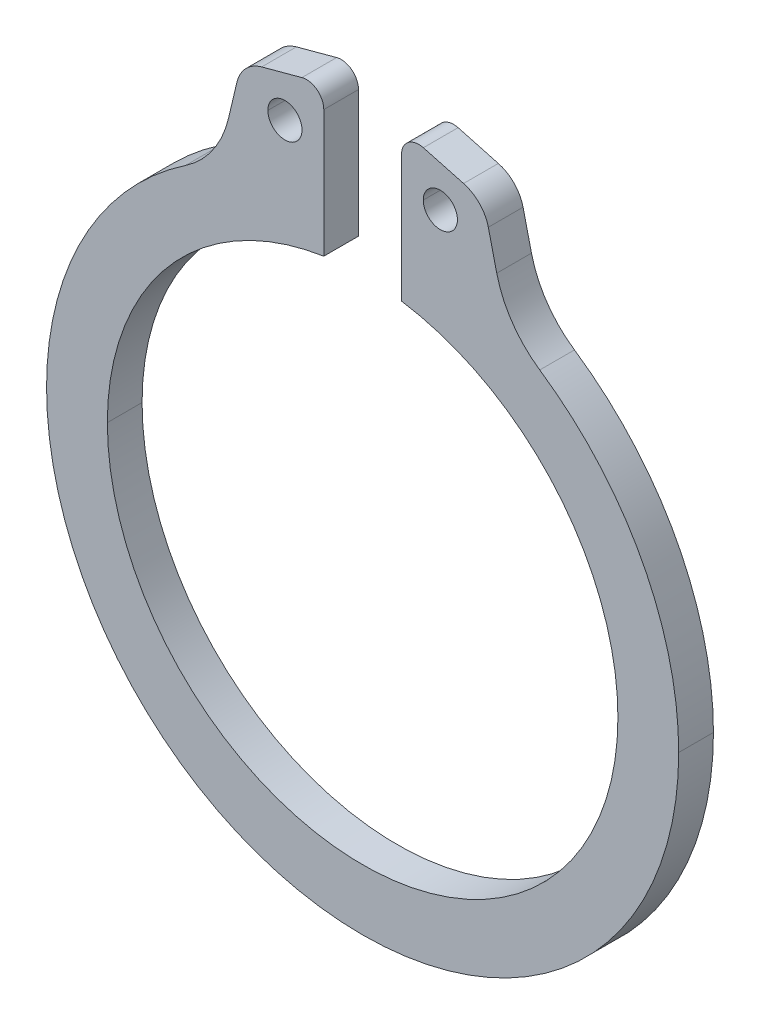
ISO-10303-21;
HEADER;
FILE_DESCRIPTION(('STEP AP214'),'2;1');
FILE_NAME('part.step','',(''),(''),'','','');
FILE_SCHEMA(('AUTOMOTIVE_DESIGN { 1 0 10303 214 1 1 1 1 }'));
ENDSEC;
DATA;
#1=APPLICATION_CONTEXT('core data for automotive mechanical design processes');
#2=APPLICATION_PROTOCOL_DEFINITION('international standard','automotive_design',2000,#1);
#3=PRODUCT_CONTEXT('',#1,'mechanical');
#4=PRODUCT('Part','Part','',(#3));
#5=PRODUCT_RELATED_PRODUCT_CATEGORY('part','',(#4));
#6=PRODUCT_DEFINITION_FORMATION('','',#4);
#7=PRODUCT_DEFINITION_CONTEXT('part definition',#1,'design');
#8=PRODUCT_DEFINITION('design','',#6,#7);
#9=PRODUCT_DEFINITION_SHAPE('','',#8);
#10=(LENGTH_UNIT() NAMED_UNIT(*) SI_UNIT(.MILLI.,.METRE.));
#11=(NAMED_UNIT(*) PLANE_ANGLE_UNIT() SI_UNIT($,.RADIAN.));
#12=(NAMED_UNIT(*) SI_UNIT($,.STERADIAN.) SOLID_ANGLE_UNIT());
#13=UNCERTAINTY_MEASURE_WITH_UNIT(LENGTH_MEASURE(1.E-05),#10,'distance_accuracy_value','');
#14=(GEOMETRIC_REPRESENTATION_CONTEXT(3) GLOBAL_UNCERTAINTY_ASSIGNED_CONTEXT((#13)) GLOBAL_UNIT_ASSIGNED_CONTEXT((#10,
#11,#12)) REPRESENTATION_CONTEXT('',''));
#15=CARTESIAN_POINT('',(0.,0.,0.));
#16=DIRECTION('',(0.,0.,1.));
#17=DIRECTION('',(1.,0.,0.));
#18=AXIS2_PLACEMENT_3D('',#15,#16,#17);
#19=CARTESIAN_POINT('',(-2.23684537066101,10.0959344006117,1.));
#20=DIRECTION('',(0.,0.,-1.));
#21=DIRECTION('',(-1.,0.,0.));
#22=AXIS2_PLACEMENT_3D('',#19,#20,#21);
#23=CYLINDRICAL_SURFACE('',#22,0.491728838169198);
#24=CARTESIAN_POINT('',(-2.23684537066101,10.0959344006117,1.));
#25=DIRECTION('',(0.,0.,1.));
#26=DIRECTION('',(-1.,0.,0.));
#27=AXIS2_PLACEMENT_3D('',#24,#25,#26);
#28=CIRCLE('',#27,0.491728838169198);
#29=CARTESIAN_POINT('',(-2.72857420883021,10.0959344006117,1.));
#30=VERTEX_POINT('',#29);
#31=CARTESIAN_POINT('',(-1.74511653249181,10.0959344006117,1.));
#32=VERTEX_POINT('',#31);
#33=EDGE_CURVE('E11',#30,#32,#28,.T.);
#34=ORIENTED_EDGE('',*,*,#33,.T.);
#35=DIRECTION('',(0.,0.,-1.));
#36=VECTOR('',#35,1.);
#37=CARTESIAN_POINT('',(-1.74511653249181,10.0959344006117,1.));
#38=LINE('',#37,#36);
#39=CARTESIAN_POINT('',(-1.74511653249181,10.0959344006117,0.));
#40=VERTEX_POINT('',#39);
#41=EDGE_CURVE('E28',#32,#40,#38,.T.);
#42=ORIENTED_EDGE('',*,*,#41,.T.);
#43=CARTESIAN_POINT('',(-2.23684537066101,10.0959344006117,0.));
#44=DIRECTION('',(0.,0.,1.));
#45=DIRECTION('',(-1.,0.,0.));
#46=AXIS2_PLACEMENT_3D('',#43,#44,#45);
#47=CIRCLE('',#46,0.491728838169198);
#48=CARTESIAN_POINT('',(-2.72857420883021,10.0959344006117,0.));
#49=VERTEX_POINT('',#48);
#50=EDGE_CURVE('E336',#49,#40,#47,.T.);
#51=ORIENTED_EDGE('',*,*,#50,.F.);
#52=DIRECTION('',(0.,0.,-1.));
#53=VECTOR('',#52,1.);
#54=CARTESIAN_POINT('',(-2.72857420883021,10.0959344006117,1.));
#55=LINE('',#54,#53);
#56=EDGE_CURVE('E417',#30,#49,#55,.T.);
#57=ORIENTED_EDGE('',*,*,#56,.F.);
#58=EDGE_LOOP('',(#34,#42,#51,#57));
#59=FACE_BOUND('',#58,.T.);
#60=ADVANCED_FACE('F17',(#59),#23,.F.);
#61=CARTESIAN_POINT('',(2.23684537066101,10.0959344006117,1.));
#62=DIRECTION('',(0.,0.,-1.));
#63=DIRECTION('',(-1.,0.,0.));
#64=AXIS2_PLACEMENT_3D('',#61,#62,#63);
#65=CYLINDRICAL_SURFACE('',#64,0.491728838169198);
#66=CARTESIAN_POINT('',(2.23684537066101,10.0959344006117,1.));
#67=DIRECTION('',(0.,0.,1.));
#68=DIRECTION('',(1.,0.,0.));
#69=AXIS2_PLACEMENT_3D('',#66,#67,#68);
#70=CIRCLE('',#69,0.491728838169198);
#71=CARTESIAN_POINT('',(1.74511653249181,10.0959344006117,1.));
#72=VERTEX_POINT('',#71);
#73=CARTESIAN_POINT('',(2.72857420883021,10.0959344006117,1.));
#74=VERTEX_POINT('',#73);
#75=EDGE_CURVE('E316',#72,#74,#70,.T.);
#76=ORIENTED_EDGE('',*,*,#75,.T.);
#77=DIRECTION('',(0.,0.,-1.));
#78=VECTOR('',#77,1.);
#79=CARTESIAN_POINT('',(2.72857420883021,10.0959344006117,1.));
#80=LINE('',#79,#78);
#81=CARTESIAN_POINT('',(2.72857420883021,10.0959344006117,0.));
#82=VERTEX_POINT('',#81);
#83=EDGE_CURVE('E320',#74,#82,#80,.T.);
#84=ORIENTED_EDGE('',*,*,#83,.T.);
#85=CARTESIAN_POINT('',(2.23684537066101,10.0959344006117,0.));
#86=DIRECTION('',(0.,0.,1.));
#87=DIRECTION('',(1.,0.,0.));
#88=AXIS2_PLACEMENT_3D('',#85,#86,#87);
#89=CIRCLE('',#88,0.491728838169198);
#90=CARTESIAN_POINT('',(1.74511653249181,10.0959344006117,0.));
#91=VERTEX_POINT('',#90);
#92=EDGE_CURVE('E169',#91,#82,#89,.T.);
#93=ORIENTED_EDGE('',*,*,#92,.F.);
#94=DIRECTION('',(0.,0.,-1.));
#95=VECTOR('',#94,1.);
#96=CARTESIAN_POINT('',(1.74511653249181,10.0959344006117,1.));
#97=LINE('',#96,#95);
#98=EDGE_CURVE('E186',#72,#91,#97,.T.);
#99=ORIENTED_EDGE('',*,*,#98,.F.);
#100=EDGE_LOOP('',(#76,#84,#93,#99));
#101=FACE_BOUND('',#100,.T.);
#102=ADVANCED_FACE('F581',(#101),#65,.F.);
#103=CARTESIAN_POINT('',(0.,0.,1.));
#104=DIRECTION('',(0.,0.,-1.));
#105=DIRECTION('',(-1.,0.,0.));
#106=AXIS2_PLACEMENT_3D('',#103,#104,#105);
#107=CYLINDRICAL_SURFACE('',#106,9.1);
#108=CARTESIAN_POINT('',(0.,0.,1.));
#109=DIRECTION('',(0.,0.,1.));
#110=DIRECTION('',(1.,0.,0.));
#111=AXIS2_PLACEMENT_3D('',#108,#109,#110);
#112=CIRCLE('',#111,9.1);
#113=CARTESIAN_POINT('',(9.1,0.,1.));
#114=VERTEX_POINT('',#113);
#115=CARTESIAN_POINT('',(5.09935284974255,7.53701535847065,1.));
#116=VERTEX_POINT('',#115);
#117=EDGE_CURVE('E394',#114,#116,#112,.T.);
#118=ORIENTED_EDGE('',*,*,#117,.F.);
#119=DIRECTION('',(0.,0.,-1.));
#120=VECTOR('',#119,1.);
#121=CARTESIAN_POINT('',(9.1,0.,1.));
#122=LINE('',#121,#120);
#123=CARTESIAN_POINT('',(9.1,0.,0.));
#124=VERTEX_POINT('',#123);
#125=EDGE_CURVE('E420',#114,#124,#122,.T.);
#126=ORIENTED_EDGE('',*,*,#125,.T.);
#127=CARTESIAN_POINT('',(0.,0.,0.));
#128=DIRECTION('',(0.,0.,1.));
#129=DIRECTION('',(1.,0.,0.));
#130=AXIS2_PLACEMENT_3D('',#127,#128,#129);
#131=CIRCLE('',#130,9.1);
#132=CARTESIAN_POINT('',(5.09935284974255,7.53701535847065,0.));
#133=VERTEX_POINT('',#132);
#134=EDGE_CURVE('E348',#124,#133,#131,.T.);
#135=ORIENTED_EDGE('',*,*,#134,.T.);
#136=DIRECTION('',(0.,0.,-1.));
#137=VECTOR('',#136,1.);
#138=CARTESIAN_POINT('',(5.09935284974255,7.53701535847065,1.));
#139=LINE('',#138,#137);
#140=EDGE_CURVE('E476',#116,#133,#139,.T.);
#141=ORIENTED_EDGE('',*,*,#140,.F.);
#142=EDGE_LOOP('',(#118,#126,#135,#141));
#143=FACE_BOUND('',#142,.T.);
#144=ADVANCED_FACE('F568',(#143),#107,.T.);
#145=CARTESIAN_POINT('',(0.,0.,1.));
#146=DIRECTION('',(0.,0.,-1.));
#147=DIRECTION('',(-1.,0.,0.));
#148=AXIS2_PLACEMENT_3D('',#145,#146,#147);
#149=CYLINDRICAL_SURFACE('',#148,9.1);
#150=ORIENTED_EDGE('',*,*,#125,.F.);
#151=CARTESIAN_POINT('',(0.,0.,1.));
#152=DIRECTION('',(0.,0.,1.));
#153=DIRECTION('',(1.,0.,0.));
#154=AXIS2_PLACEMENT_3D('',#151,#152,#153);
#155=CIRCLE('',#154,9.1);
#156=CARTESIAN_POINT('',(-9.1,0.,1.));
#157=VERTEX_POINT('',#156);
#158=EDGE_CURVE('E390',#157,#114,#155,.T.);
#159=ORIENTED_EDGE('',*,*,#158,.F.);
#160=DIRECTION('',(0.,0.,-1.));
#161=VECTOR('',#160,1.);
#162=CARTESIAN_POINT('',(-9.1,0.,1.));
#163=LINE('',#162,#161);
#164=CARTESIAN_POINT('',(-9.1,0.,0.));
#165=VERTEX_POINT('',#164);
#166=EDGE_CURVE('E344',#157,#165,#163,.T.);
#167=ORIENTED_EDGE('',*,*,#166,.T.);
#168=CARTESIAN_POINT('',(0.,0.,0.));
#169=DIRECTION('',(0.,0.,1.));
#170=DIRECTION('',(1.,0.,0.));
#171=AXIS2_PLACEMENT_3D('',#168,#169,#170);
#172=CIRCLE('',#171,9.1);
#173=EDGE_CURVE('E349',#165,#124,#172,.T.);
#174=ORIENTED_EDGE('',*,*,#173,.T.);
#175=EDGE_LOOP('',(#150,#159,#167,#174));
#176=FACE_BOUND('',#175,.T.);
#177=ADVANCED_FACE('F563',(#176),#149,.T.);
#178=CARTESIAN_POINT('',(0.,0.,1.));
#179=DIRECTION('',(0.,0.,-1.));
#180=DIRECTION('',(-1.,0.,0.));
#181=AXIS2_PLACEMENT_3D('',#178,#179,#180);
#182=CYLINDRICAL_SURFACE('',#181,7.35);
#183=CARTESIAN_POINT('',(0.,0.,1.));
#184=DIRECTION('',(0.,0.,-1.));
#185=DIRECTION('',(1.,0.,0.));
#186=AXIS2_PLACEMENT_3D('',#183,#184,#185);
#187=CIRCLE('',#186,7.35);
#188=CARTESIAN_POINT('',(7.35,0.,1.));
#189=VERTEX_POINT('',#188);
#190=CARTESIAN_POINT('',(-7.35,0.,1.));
#191=VERTEX_POINT('',#190);
#192=EDGE_CURVE('E396',#189,#191,#187,.T.);
#193=ORIENTED_EDGE('',*,*,#192,.F.);
#194=DIRECTION('',(0.,0.,-1.));
#195=VECTOR('',#194,1.);
#196=CARTESIAN_POINT('',(7.35,0.,1.));
#197=LINE('',#196,#195);
#198=CARTESIAN_POINT('',(7.35,0.,0.));
#199=VERTEX_POINT('',#198);
#200=EDGE_CURVE('E293',#189,#199,#197,.T.);
#201=ORIENTED_EDGE('',*,*,#200,.T.);
#202=CARTESIAN_POINT('',(0.,0.,0.));
#203=DIRECTION('',(0.,0.,-1.));
#204=DIRECTION('',(1.,0.,0.));
#205=AXIS2_PLACEMENT_3D('',#202,#203,#204);
#206=CIRCLE('',#205,7.35);
#207=CARTESIAN_POINT('',(-7.35,0.,0.));
#208=VERTEX_POINT('',#207);
#209=EDGE_CURVE('E282',#199,#208,#206,.T.);
#210=ORIENTED_EDGE('',*,*,#209,.T.);
#211=DIRECTION('',(0.,0.,-1.));
#212=VECTOR('',#211,1.);
#213=CARTESIAN_POINT('',(-7.35,0.,1.));
#214=LINE('',#213,#212);
#215=EDGE_CURVE('E280',#191,#208,#214,.T.);
#216=ORIENTED_EDGE('',*,*,#215,.F.);
#217=EDGE_LOOP('',(#193,#201,#210,#216));
#218=FACE_BOUND('',#217,.T.);
#219=ADVANCED_FACE('F504',(#218),#182,.F.);
#220=CARTESIAN_POINT('',(0.,0.,1.));
#221=DIRECTION('',(0.,0.,-1.));
#222=DIRECTION('',(-1.,0.,0.));
#223=AXIS2_PLACEMENT_3D('',#220,#221,#222);
#224=CYLINDRICAL_SURFACE('',#223,7.35);
#225=CARTESIAN_POINT('',(0.,0.,1.));
#226=DIRECTION('',(0.,0.,-1.));
#227=DIRECTION('',(1.,0.,0.));
#228=AXIS2_PLACEMENT_3D('',#225,#226,#227);
#229=CIRCLE('',#228,7.35);
#230=CARTESIAN_POINT('',(-1.1184226853305,7.26440848912959,1.));
#231=VERTEX_POINT('',#230);
#232=EDGE_CURVE('E400',#191,#231,#229,.T.);
#233=ORIENTED_EDGE('',*,*,#232,.F.);
#234=ORIENTED_EDGE('',*,*,#215,.T.);
#235=CARTESIAN_POINT('',(0.,0.,0.));
#236=DIRECTION('',(0.,0.,-1.));
#237=DIRECTION('',(1.,0.,0.));
#238=AXIS2_PLACEMENT_3D('',#235,#236,#237);
#239=CIRCLE('',#238,7.35);
#240=CARTESIAN_POINT('',(-1.1184226853305,7.26440848912959,0.));
#241=VERTEX_POINT('',#240);
#242=EDGE_CURVE('E283',#208,#241,#239,.T.);
#243=ORIENTED_EDGE('',*,*,#242,.T.);
#244=DIRECTION('',(0.,0.,-1.));
#245=VECTOR('',#244,1.);
#246=CARTESIAN_POINT('',(-1.1184226853305,7.26440848912959,1.));
#247=LINE('',#246,#245);
#248=EDGE_CURVE('E370',#231,#241,#247,.T.);
#249=ORIENTED_EDGE('',*,*,#248,.F.);
#250=EDGE_LOOP('',(#233,#234,#243,#249));
#251=FACE_BOUND('',#250,.T.);
#252=ADVANCED_FACE('F650',(#251),#224,.F.);
#253=CARTESIAN_POINT('',(6.78045818482251,10.021745696428,1.));
#254=DIRECTION('',(0.,0.,-1.));
#255=DIRECTION('',(0.,-1.,0.));
#256=AXIS2_PLACEMENT_3D('',#253,#254,#255);
#257=PLANE('',#256);
#258=CARTESIAN_POINT('',(6.78045818482251,10.021745696428,1.));
#259=DIRECTION('',(0.,0.,-1.));
#260=DIRECTION('',(-1.,0.,0.));
#261=AXIS2_PLACEMENT_3D('',#258,#259,#260);
#262=CIRCLE('',#261,3.);
#263=CARTESIAN_POINT('',(3.86104743509331,9.33106423991885,1.));
#264=VERTEX_POINT('',#263);
#265=EDGE_CURVE('E296',#116,#264,#262,.T.);
#266=ORIENTED_EDGE('',*,*,#265,.T.);
#267=DIRECTION('',(-0.230227152169723,0.973136916576398,0.));
#268=VECTOR('',#267,1.);
#269=CARTESIAN_POINT('',(3.6188177346436,10.3549341943414,1.));
#270=LINE('',#269,#268);
#271=CARTESIAN_POINT('',(3.6188177346436,10.3549341943414,1.));
#272=VERTEX_POINT('',#271);
#273=EDGE_CURVE('E306',#264,#272,#270,.T.);
#274=ORIENTED_EDGE('',*,*,#273,.T.);
#275=CARTESIAN_POINT('',(2.6456808180672,10.1247070421717,1.));
#276=DIRECTION('',(0.,0.,1.));
#277=DIRECTION('',(1.,0.,0.));
#278=AXIS2_PLACEMENT_3D('',#275,#276,#277);
#279=CIRCLE('',#278,1.);
#280=CARTESIAN_POINT('',(2.90650426318065,11.0900935608673,1.));
#281=VERTEX_POINT('',#280);
#282=EDGE_CURVE('E326',#272,#281,#279,.T.);
#283=ORIENTED_EDGE('',*,*,#282,.T.);
#284=DIRECTION('',(-0.965386518695568,0.260823445113455,0.));
#285=VECTOR('',#284,1.);
#286=CARTESIAN_POINT('',(2.23684537066101,11.2710187509495,1.));
#287=LINE('',#286,#285);
#288=CARTESIAN_POINT('',(1.74883440788723,11.4028671848139,1.));
#289=VERTEX_POINT('',#288);
#290=EDGE_CURVE('E330',#281,#289,#287,.T.);
#291=ORIENTED_EDGE('',*,*,#290,.T.);
#292=CARTESIAN_POINT('',(1.61842268533051,10.9201739254661,1.));
#293=DIRECTION('',(0.,0.,1.));
#294=DIRECTION('',(-1.,0.,0.));
#295=AXIS2_PLACEMENT_3D('',#292,#293,#294);
#296=CIRCLE('',#295,0.5);
#297=CARTESIAN_POINT('',(1.1184226853305,10.9201739254661,1.));
#298=VERTEX_POINT('',#297);
#299=EDGE_CURVE('E352',#289,#298,#296,.T.);
#300=ORIENTED_EDGE('',*,*,#299,.T.);
#301=DIRECTION('',(0.,-1.,0.));
#302=VECTOR('',#301,1.);
#303=CARTESIAN_POINT('',(1.1184226853305,10.9201739254661,1.));
#304=LINE('',#303,#302);
#305=CARTESIAN_POINT('',(1.1184226853305,7.26440848912959,1.));
#306=VERTEX_POINT('',#305);
#307=EDGE_CURVE('E403',#298,#306,#304,.T.);
#308=ORIENTED_EDGE('',*,*,#307,.T.);
#309=CARTESIAN_POINT('',(0.,0.,1.));
#310=DIRECTION('',(0.,0.,-1.));
#311=DIRECTION('',(1.,0.,0.));
#312=AXIS2_PLACEMENT_3D('',#309,#310,#311);
#313=CIRCLE('',#312,7.35);
#314=EDGE_CURVE('E399',#306,#189,#313,.T.);
#315=ORIENTED_EDGE('',*,*,#314,.T.);
#316=ORIENTED_EDGE('',*,*,#192,.T.);
#317=ORIENTED_EDGE('',*,*,#232,.T.);
#318=DIRECTION('',(0.,1.,0.));
#319=VECTOR('',#318,1.);
#320=CARTESIAN_POINT('',(-1.1184226853305,9.03100939524138,1.));
#321=LINE('',#320,#319);
#322=CARTESIAN_POINT('',(-1.1184226853305,10.9201739254661,1.));
#323=VERTEX_POINT('',#322);
#324=EDGE_CURVE('E414',#231,#323,#321,.T.);
#325=ORIENTED_EDGE('',*,*,#324,.T.);
#326=CARTESIAN_POINT('',(-1.61842268533051,10.9201739254661,1.));
#327=DIRECTION('',(0.,0.,1.));
#328=DIRECTION('',(1.,0.,0.));
#329=AXIS2_PLACEMENT_3D('',#326,#327,#328);
#330=CIRCLE('',#329,0.5);
#331=CARTESIAN_POINT('',(-1.74883440788723,11.4028671848139,1.));
#332=VERTEX_POINT('',#331);
#333=EDGE_CURVE('E442',#323,#332,#330,.T.);
#334=ORIENTED_EDGE('',*,*,#333,.T.);
#335=DIRECTION('',(-0.965386518695568,-0.260823445113454,0.));
#336=VECTOR('',#335,1.);
#337=CARTESIAN_POINT('',(-1.74883440788723,11.4028671848139,1.));
#338=LINE('',#337,#336);
#339=CARTESIAN_POINT('',(-2.90650426318065,11.0900935608673,1.));
#340=VERTEX_POINT('',#339);
#341=EDGE_CURVE('E253',#332,#340,#338,.T.);
#342=ORIENTED_EDGE('',*,*,#341,.T.);
#343=CARTESIAN_POINT('',(-2.6456808180672,10.1247070421717,1.));
#344=DIRECTION('',(0.,0.,1.));
#345=DIRECTION('',(1.,0.,0.));
#346=AXIS2_PLACEMENT_3D('',#343,#344,#345);
#347=CIRCLE('',#346,1.);
#348=CARTESIAN_POINT('',(-3.6188177346436,10.3549341943414,1.));
#349=VERTEX_POINT('',#348);
#350=EDGE_CURVE('E245',#340,#349,#347,.T.);
#351=ORIENTED_EDGE('',*,*,#350,.T.);
#352=DIRECTION('',(-0.230227152169723,-0.973136916576398,0.));
#353=VECTOR('',#352,1.);
#354=CARTESIAN_POINT('',(-3.6188177346436,10.3549341943414,1.));
#355=LINE('',#354,#353);
#356=CARTESIAN_POINT('',(-3.86104743509331,9.33106423991885,1.));
#357=VERTEX_POINT('',#356);
#358=EDGE_CURVE('E234',#349,#357,#355,.T.);
#359=ORIENTED_EDGE('',*,*,#358,.T.);
#360=CARTESIAN_POINT('',(-6.78045818482251,10.021745696428,1.));
#361=DIRECTION('',(0.,0.,-1.));
#362=DIRECTION('',(1.,0.,0.));
#363=AXIS2_PLACEMENT_3D('',#360,#361,#362);
#364=CIRCLE('',#363,3.);
#365=CARTESIAN_POINT('',(-5.09935284974255,7.53701535847066,1.));
#366=VERTEX_POINT('',#365);
#367=EDGE_CURVE('E246',#357,#366,#364,.T.);
#368=ORIENTED_EDGE('',*,*,#367,.T.);
#369=CARTESIAN_POINT('',(0.,0.,1.));
#370=DIRECTION('',(0.,0.,1.));
#371=DIRECTION('',(1.,0.,0.));
#372=AXIS2_PLACEMENT_3D('',#369,#370,#371);
#373=CIRCLE('',#372,9.1);
#374=EDGE_CURVE('E393',#366,#157,#373,.T.);
#375=ORIENTED_EDGE('',*,*,#374,.T.);
#376=ORIENTED_EDGE('',*,*,#158,.T.);
#377=ORIENTED_EDGE('',*,*,#117,.T.);
#378=EDGE_LOOP('',(#266,#274,#283,#291,#300,#308,#315,#316,#317,#325,#334,#342,#351,#359,#368,
#375,#376,#377));
#379=FACE_BOUND('',#378,.T.);
#380=ORIENTED_EDGE('',*,*,#75,.F.);
#381=CARTESIAN_POINT('',(2.23684537066101,10.0959344006117,1.));
#382=DIRECTION('',(0.,0.,1.));
#383=DIRECTION('',(1.,0.,0.));
#384=AXIS2_PLACEMENT_3D('',#381,#382,#383);
#385=CIRCLE('',#384,0.491728838169198);
#386=EDGE_CURVE('E384',#74,#72,#385,.T.);
#387=ORIENTED_EDGE('',*,*,#386,.F.);
#388=EDGE_LOOP('',(#380,#387));
#389=FACE_BOUND('',#388,.T.);
#390=ORIENTED_EDGE('',*,*,#33,.F.);
#391=CARTESIAN_POINT('',(-2.23684537066101,10.0959344006117,1.));
#392=DIRECTION('',(0.,0.,1.));
#393=DIRECTION('',(-1.,0.,0.));
#394=AXIS2_PLACEMENT_3D('',#391,#392,#393);
#395=CIRCLE('',#394,0.491728838169198);
#396=EDGE_CURVE('E415',#32,#30,#395,.T.);
#397=ORIENTED_EDGE('',*,*,#396,.F.);
#398=EDGE_LOOP('',(#390,#397));
#399=FACE_BOUND('',#398,.T.);
#400=ADVANCED_FACE('F250',(#379,#389,#399),#257,.F.);
#401=CARTESIAN_POINT('',(6.78045818482251,10.021745696428,0.));
#402=DIRECTION('',(0.,0.,-1.));
#403=DIRECTION('',(0.,-1.,0.));
#404=AXIS2_PLACEMENT_3D('',#401,#402,#403);
#405=PLANE('',#404);
#406=CARTESIAN_POINT('',(6.78045818482251,10.021745696428,0.));
#407=DIRECTION('',(0.,0.,-1.));
#408=DIRECTION('',(-1.,0.,0.));
#409=AXIS2_PLACEMENT_3D('',#406,#407,#408);
#410=CIRCLE('',#409,3.);
#411=CARTESIAN_POINT('',(3.86104743509331,9.33106423991885,0.));
#412=VERTEX_POINT('',#411);
#413=EDGE_CURVE('E449',#133,#412,#410,.T.);
#414=ORIENTED_EDGE('',*,*,#413,.F.);
#415=ORIENTED_EDGE('',*,*,#134,.F.);
#416=ORIENTED_EDGE('',*,*,#173,.F.);
#417=CARTESIAN_POINT('',(0.,0.,0.));
#418=DIRECTION('',(0.,0.,1.));
#419=DIRECTION('',(1.,0.,0.));
#420=AXIS2_PLACEMENT_3D('',#417,#418,#419);
#421=CIRCLE('',#420,9.1);
#422=CARTESIAN_POINT('',(-5.09935284974255,7.53701535847066,0.));
#423=VERTEX_POINT('',#422);
#424=EDGE_CURVE('E386',#423,#165,#421,.T.);
#425=ORIENTED_EDGE('',*,*,#424,.F.);
#426=CARTESIAN_POINT('',(-6.78045818482251,10.021745696428,0.));
#427=DIRECTION('',(0.,0.,-1.));
#428=DIRECTION('',(1.,0.,0.));
#429=AXIS2_PLACEMENT_3D('',#426,#427,#428);
#430=CIRCLE('',#429,3.);
#431=CARTESIAN_POINT('',(-3.86104743509331,9.33106423991885,0.));
#432=VERTEX_POINT('',#431);
#433=EDGE_CURVE('E264',#432,#423,#430,.T.);
#434=ORIENTED_EDGE('',*,*,#433,.F.);
#435=DIRECTION('',(-0.230227152169723,-0.973136916576398,0.));
#436=VECTOR('',#435,1.);
#437=CARTESIAN_POINT('',(-3.6188177346436,10.3549341943414,0.));
#438=LINE('',#437,#436);
#439=CARTESIAN_POINT('',(-3.6188177346436,10.3549341943414,0.));
#440=VERTEX_POINT('',#439);
#441=EDGE_CURVE('E263',#440,#432,#438,.T.);
#442=ORIENTED_EDGE('',*,*,#441,.F.);
#443=CARTESIAN_POINT('',(-2.6456808180672,10.1247070421717,0.));
#444=DIRECTION('',(0.,0.,1.));
#445=DIRECTION('',(1.,0.,0.));
#446=AXIS2_PLACEMENT_3D('',#443,#444,#445);
#447=CIRCLE('',#446,1.);
#448=CARTESIAN_POINT('',(-2.90650426318065,11.0900935608673,0.));
#449=VERTEX_POINT('',#448);
#450=EDGE_CURVE('E261',#449,#440,#447,.T.);
#451=ORIENTED_EDGE('',*,*,#450,.F.);
#452=DIRECTION('',(-0.965386518695568,-0.260823445113455,0.));
#453=VECTOR('',#452,1.);
#454=CARTESIAN_POINT('',(-2.23684537066101,11.2710187509495,0.));
#455=LINE('',#454,#453);
#456=CARTESIAN_POINT('',(-1.74883440788723,11.4028671848139,0.));
#457=VERTEX_POINT('',#456);
#458=EDGE_CURVE('E321',#457,#449,#455,.T.);
#459=ORIENTED_EDGE('',*,*,#458,.F.);
#460=CARTESIAN_POINT('',(-1.61842268533051,10.9201739254661,0.));
#461=DIRECTION('',(0.,0.,1.));
#462=DIRECTION('',(1.,0.,0.));
#463=AXIS2_PLACEMENT_3D('',#460,#461,#462);
#464=CIRCLE('',#463,0.5);
#465=CARTESIAN_POINT('',(-1.1184226853305,10.9201739254661,0.));
#466=VERTEX_POINT('',#465);
#467=EDGE_CURVE('E363',#466,#457,#464,.T.);
#468=ORIENTED_EDGE('',*,*,#467,.F.);
#469=DIRECTION('',(0.,1.,0.));
#470=VECTOR('',#469,1.);
#471=CARTESIAN_POINT('',(-1.1184226853305,10.9201739254661,0.));
#472=LINE('',#471,#470);
#473=EDGE_CURVE('E377',#241,#466,#472,.T.);
#474=ORIENTED_EDGE('',*,*,#473,.F.);
#475=ORIENTED_EDGE('',*,*,#242,.F.);
#476=ORIENTED_EDGE('',*,*,#209,.F.);
#477=CARTESIAN_POINT('',(0.,0.,0.));
#478=DIRECTION('',(0.,0.,-1.));
#479=DIRECTION('',(1.,0.,0.));
#480=AXIS2_PLACEMENT_3D('',#477,#478,#479);
#481=CIRCLE('',#480,7.35);
#482=CARTESIAN_POINT('',(1.1184226853305,7.26440848912959,0.));
#483=VERTEX_POINT('',#482);
#484=EDGE_CURVE('E389',#483,#199,#481,.T.);
#485=ORIENTED_EDGE('',*,*,#484,.F.);
#486=DIRECTION('',(0.,-1.,0.));
#487=VECTOR('',#486,1.);
#488=CARTESIAN_POINT('',(1.1184226853305,9.03100939524138,0.));
#489=LINE('',#488,#487);
#490=CARTESIAN_POINT('',(1.1184226853305,10.9201739254661,0.));
#491=VERTEX_POINT('',#490);
#492=EDGE_CURVE('E315',#491,#483,#489,.T.);
#493=ORIENTED_EDGE('',*,*,#492,.F.);
#494=CARTESIAN_POINT('',(1.61842268533051,10.9201739254661,0.));
#495=DIRECTION('',(0.,0.,1.));
#496=DIRECTION('',(-1.,0.,0.));
#497=AXIS2_PLACEMENT_3D('',#494,#495,#496);
#498=CIRCLE('',#497,0.5);
#499=CARTESIAN_POINT('',(1.74883440788723,11.4028671848139,0.));
#500=VERTEX_POINT('',#499);
#501=EDGE_CURVE('E314',#500,#491,#498,.T.);
#502=ORIENTED_EDGE('',*,*,#501,.F.);
#503=DIRECTION('',(-0.965386518695568,0.260823445113455,0.));
#504=VECTOR('',#503,1.);
#505=CARTESIAN_POINT('',(1.74883440788723,11.4028671848139,0.));
#506=LINE('',#505,#504);
#507=CARTESIAN_POINT('',(2.90650426318065,11.0900935608673,0.));
#508=VERTEX_POINT('',#507);
#509=EDGE_CURVE('E219',#508,#500,#506,.T.);
#510=ORIENTED_EDGE('',*,*,#509,.F.);
#511=CARTESIAN_POINT('',(2.6456808180672,10.1247070421717,0.));
#512=DIRECTION('',(0.,0.,1.));
#513=DIRECTION('',(1.,0.,0.));
#514=AXIS2_PLACEMENT_3D('',#511,#512,#513);
#515=CIRCLE('',#514,1.);
#516=CARTESIAN_POINT('',(3.6188177346436,10.3549341943414,0.));
#517=VERTEX_POINT('',#516);
#518=EDGE_CURVE('E210',#517,#508,#515,.T.);
#519=ORIENTED_EDGE('',*,*,#518,.F.);
#520=DIRECTION('',(-0.230227152169723,0.973136916576398,0.));
#521=VECTOR('',#520,1.);
#522=CARTESIAN_POINT('',(3.6188177346436,10.3549341943414,0.));
#523=LINE('',#522,#521);
#524=EDGE_CURVE('E437',#412,#517,#523,.T.);
#525=ORIENTED_EDGE('',*,*,#524,.F.);
#526=EDGE_LOOP('',(#414,#415,#416,#425,#434,#442,#451,#459,#468,#474,#475,#476,#485,#493,#502,
#510,#519,#525));
#527=FACE_BOUND('',#526,.T.);
#528=ORIENTED_EDGE('',*,*,#92,.T.);
#529=CARTESIAN_POINT('',(2.23684537066101,10.0959344006117,0.));
#530=DIRECTION('',(0.,0.,1.));
#531=DIRECTION('',(1.,0.,0.));
#532=AXIS2_PLACEMENT_3D('',#529,#530,#531);
#533=CIRCLE('',#532,0.491728838169198);
#534=EDGE_CURVE('E333',#82,#91,#533,.T.);
#535=ORIENTED_EDGE('',*,*,#534,.T.);
#536=EDGE_LOOP('',(#528,#535));
#537=FACE_BOUND('',#536,.T.);
#538=ORIENTED_EDGE('',*,*,#50,.T.);
#539=CARTESIAN_POINT('',(-2.23684537066101,10.0959344006117,0.));
#540=DIRECTION('',(0.,0.,1.));
#541=DIRECTION('',(-1.,0.,0.));
#542=AXIS2_PLACEMENT_3D('',#539,#540,#541);
#543=CIRCLE('',#542,0.491728838169198);
#544=EDGE_CURVE('E445',#40,#49,#543,.T.);
#545=ORIENTED_EDGE('',*,*,#544,.T.);
#546=EDGE_LOOP('',(#538,#545));
#547=FACE_BOUND('',#546,.T.);
#548=ADVANCED_FACE('F362',(#527,#537,#547),#405,.T.);
#549=CARTESIAN_POINT('',(6.78045818482251,10.021745696428,1.));
#550=DIRECTION('',(0.,0.,-1.));
#551=DIRECTION('',(-1.,0.,0.));
#552=AXIS2_PLACEMENT_3D('',#549,#550,#551);
#553=CYLINDRICAL_SURFACE('',#552,3.);
#554=ORIENTED_EDGE('',*,*,#413,.T.);
#555=DIRECTION('',(0.,0.,-1.));
#556=VECTOR('',#555,1.);
#557=CARTESIAN_POINT('',(3.86104743509331,9.33106423991885,1.));
#558=LINE('',#557,#556);
#559=EDGE_CURVE('E21',#264,#412,#558,.T.);
#560=ORIENTED_EDGE('',*,*,#559,.F.);
#561=ORIENTED_EDGE('',*,*,#265,.F.);
#562=ORIENTED_EDGE('',*,*,#140,.T.);
#563=EDGE_LOOP('',(#554,#560,#561,#562));
#564=FACE_BOUND('',#563,.T.);
#565=ADVANCED_FACE('F627',(#564),#553,.F.);
#566=CARTESIAN_POINT('',(3.6188177346436,10.3549341943414,1.));
#567=DIRECTION('',(-0.973136916576398,-0.230227152169723,0.));
#568=DIRECTION('',(-0.230227152169723,0.973136916576398,0.));
#569=AXIS2_PLACEMENT_3D('',#566,#567,#568);
#570=PLANE('',#569);
#571=ORIENTED_EDGE('',*,*,#524,.T.);
#572=DIRECTION('',(0.,0.,-1.));
#573=VECTOR('',#572,1.);
#574=CARTESIAN_POINT('',(3.6188177346436,10.3549341943414,1.));
#575=LINE('',#574,#573);
#576=EDGE_CURVE('E337',#272,#517,#575,.T.);
#577=ORIENTED_EDGE('',*,*,#576,.F.);
#578=ORIENTED_EDGE('',*,*,#273,.F.);
#579=ORIENTED_EDGE('',*,*,#559,.T.);
#580=EDGE_LOOP('',(#571,#577,#578,#579));
#581=FACE_BOUND('',#580,.T.);
#582=ADVANCED_FACE('F539',(#581),#570,.F.);
#583=CARTESIAN_POINT('',(2.6456808180672,10.1247070421717,1.));
#584=DIRECTION('',(0.,0.,-1.));
#585=DIRECTION('',(-1.,0.,0.));
#586=AXIS2_PLACEMENT_3D('',#583,#584,#585);
#587=CYLINDRICAL_SURFACE('',#586,1.);
#588=ORIENTED_EDGE('',*,*,#518,.T.);
#589=DIRECTION('',(0.,0.,-1.));
#590=VECTOR('',#589,1.);
#591=CARTESIAN_POINT('',(2.90650426318065,11.0900935608673,1.));
#592=LINE('',#591,#590);
#593=EDGE_CURVE('E462',#281,#508,#592,.T.);
#594=ORIENTED_EDGE('',*,*,#593,.F.);
#595=ORIENTED_EDGE('',*,*,#282,.F.);
#596=ORIENTED_EDGE('',*,*,#576,.T.);
#597=EDGE_LOOP('',(#588,#594,#595,#596));
#598=FACE_BOUND('',#597,.T.);
#599=ADVANCED_FACE('F19',(#598),#587,.T.);
#600=CARTESIAN_POINT('',(1.74883440788723,11.4028671848139,1.));
#601=DIRECTION('',(-0.260823445113455,-0.965386518695568,0.));
#602=DIRECTION('',(-0.965386518695568,0.260823445113455,0.));
#603=AXIS2_PLACEMENT_3D('',#600,#601,#602);
#604=PLANE('',#603);
#605=ORIENTED_EDGE('',*,*,#509,.T.);
#606=DIRECTION('',(0.,0.,-1.));
#607=VECTOR('',#606,1.);
#608=CARTESIAN_POINT('',(1.74883440788723,11.4028671848139,1.));
#609=LINE('',#608,#607);
#610=EDGE_CURVE('E311',#289,#500,#609,.T.);
#611=ORIENTED_EDGE('',*,*,#610,.F.);
#612=ORIENTED_EDGE('',*,*,#290,.F.);
#613=ORIENTED_EDGE('',*,*,#593,.T.);
#614=EDGE_LOOP('',(#605,#611,#612,#613));
#615=FACE_BOUND('',#614,.T.);
#616=ADVANCED_FACE('F521',(#615),#604,.F.);
#617=CARTESIAN_POINT('',(1.61842268533051,10.9201739254661,1.));
#618=DIRECTION('',(0.,0.,-1.));
#619=DIRECTION('',(-1.,0.,0.));
#620=AXIS2_PLACEMENT_3D('',#617,#618,#619);
#621=CYLINDRICAL_SURFACE('',#620,0.5);
#622=ORIENTED_EDGE('',*,*,#501,.T.);
#623=DIRECTION('',(0.,0.,-1.));
#624=VECTOR('',#623,1.);
#625=CARTESIAN_POINT('',(1.1184226853305,10.9201739254661,1.));
#626=LINE('',#625,#624);
#627=EDGE_CURVE('E455',#298,#491,#626,.T.);
#628=ORIENTED_EDGE('',*,*,#627,.F.);
#629=ORIENTED_EDGE('',*,*,#299,.F.);
#630=ORIENTED_EDGE('',*,*,#610,.T.);
#631=EDGE_LOOP('',(#622,#628,#629,#630));
#632=FACE_BOUND('',#631,.T.);
#633=ADVANCED_FACE('F533',(#632),#621,.T.);
#634=CARTESIAN_POINT('',(1.1184226853305,9.03100939524138,1.));
#635=DIRECTION('',(1.,0.,0.));
#636=DIRECTION('',(0.,1.,0.));
#637=AXIS2_PLACEMENT_3D('',#634,#635,#636);
#638=PLANE('',#637);
#639=ORIENTED_EDGE('',*,*,#492,.T.);
#640=DIRECTION('',(0.,0.,-1.));
#641=VECTOR('',#640,1.);
#642=CARTESIAN_POINT('',(1.1184226853305,7.26440848912959,1.));
#643=LINE('',#642,#641);
#644=EDGE_CURVE('E467',#306,#483,#643,.T.);
#645=ORIENTED_EDGE('',*,*,#644,.F.);
#646=ORIENTED_EDGE('',*,*,#307,.F.);
#647=ORIENTED_EDGE('',*,*,#627,.T.);
#648=EDGE_LOOP('',(#639,#645,#646,#647));
#649=FACE_BOUND('',#648,.T.);
#650=ADVANCED_FACE('F670',(#649),#638,.F.);
#651=CARTESIAN_POINT('',(0.,0.,1.));
#652=DIRECTION('',(0.,0.,-1.));
#653=DIRECTION('',(-1.,0.,0.));
#654=AXIS2_PLACEMENT_3D('',#651,#652,#653);
#655=CYLINDRICAL_SURFACE('',#654,7.35);
#656=ORIENTED_EDGE('',*,*,#200,.F.);
#657=ORIENTED_EDGE('',*,*,#314,.F.);
#658=ORIENTED_EDGE('',*,*,#644,.T.);
#659=ORIENTED_EDGE('',*,*,#484,.T.);
#660=EDGE_LOOP('',(#656,#657,#658,#659));
#661=FACE_BOUND('',#660,.T.);
#662=ADVANCED_FACE('F507',(#661),#655,.F.);
#663=CARTESIAN_POINT('',(-1.1184226853305,10.9201739254661,1.));
#664=DIRECTION('',(-1.,0.,0.));
#665=DIRECTION('',(0.,0.,1.));
#666=AXIS2_PLACEMENT_3D('',#663,#664,#665);
#667=PLANE('',#666);
#668=ORIENTED_EDGE('',*,*,#473,.T.);
#669=DIRECTION('',(0.,0.,-1.));
#670=VECTOR('',#669,1.);
#671=CARTESIAN_POINT('',(-1.1184226853305,10.9201739254661,1.));
#672=LINE('',#671,#670);
#673=EDGE_CURVE('E325',#323,#466,#672,.T.);
#674=ORIENTED_EDGE('',*,*,#673,.F.);
#675=ORIENTED_EDGE('',*,*,#324,.F.);
#676=ORIENTED_EDGE('',*,*,#248,.T.);
#677=EDGE_LOOP('',(#668,#674,#675,#676));
#678=FACE_BOUND('',#677,.T.);
#679=ADVANCED_FACE('F501',(#678),#667,.F.);
#680=CARTESIAN_POINT('',(-1.61842268533051,10.9201739254661,1.));
#681=DIRECTION('',(0.,0.,-1.));
#682=DIRECTION('',(-1.,0.,0.));
#683=AXIS2_PLACEMENT_3D('',#680,#681,#682);
#684=CYLINDRICAL_SURFACE('',#683,0.5);
#685=ORIENTED_EDGE('',*,*,#467,.T.);
#686=DIRECTION('',(0.,0.,-1.));
#687=VECTOR('',#686,1.);
#688=CARTESIAN_POINT('',(-1.74883440788723,11.4028671848139,1.));
#689=LINE('',#688,#687);
#690=EDGE_CURVE('E279',#332,#457,#689,.T.);
#691=ORIENTED_EDGE('',*,*,#690,.F.);
#692=ORIENTED_EDGE('',*,*,#333,.F.);
#693=ORIENTED_EDGE('',*,*,#673,.T.);
#694=EDGE_LOOP('',(#685,#691,#692,#693));
#695=FACE_BOUND('',#694,.T.);
#696=ADVANCED_FACE('F367',(#695),#684,.T.);
#697=CARTESIAN_POINT('',(-2.23684537066101,11.2710187509495,1.));
#698=DIRECTION('',(0.260823445113455,-0.965386518695568,0.));
#699=DIRECTION('',(0.,0.,-1.));
#700=AXIS2_PLACEMENT_3D('',#697,#698,#699);
#701=PLANE('',#700);
#702=ORIENTED_EDGE('',*,*,#458,.T.);
#703=DIRECTION('',(0.,0.,-1.));
#704=VECTOR('',#703,1.);
#705=CARTESIAN_POINT('',(-2.90650426318065,11.0900935608673,1.));
#706=LINE('',#705,#704);
#707=EDGE_CURVE('E271',#340,#449,#706,.T.);
#708=ORIENTED_EDGE('',*,*,#707,.F.);
#709=ORIENTED_EDGE('',*,*,#341,.F.);
#710=ORIENTED_EDGE('',*,*,#690,.T.);
#711=EDGE_LOOP('',(#702,#708,#709,#710));
#712=FACE_BOUND('',#711,.T.);
#713=ADVANCED_FACE('F357',(#712),#701,.F.);
#714=CARTESIAN_POINT('',(-2.6456808180672,10.1247070421717,1.));
#715=DIRECTION('',(0.,0.,-1.));
#716=DIRECTION('',(-1.,0.,0.));
#717=AXIS2_PLACEMENT_3D('',#714,#715,#716);
#718=CYLINDRICAL_SURFACE('',#717,1.);
#719=ORIENTED_EDGE('',*,*,#450,.T.);
#720=DIRECTION('',(0.,0.,-1.));
#721=VECTOR('',#720,1.);
#722=CARTESIAN_POINT('',(-3.6188177346436,10.3549341943414,1.));
#723=LINE('',#722,#721);
#724=EDGE_CURVE('E239',#349,#440,#723,.T.);
#725=ORIENTED_EDGE('',*,*,#724,.F.);
#726=ORIENTED_EDGE('',*,*,#350,.F.);
#727=ORIENTED_EDGE('',*,*,#707,.T.);
#728=EDGE_LOOP('',(#719,#725,#726,#727));
#729=FACE_BOUND('',#728,.T.);
#730=ADVANCED_FACE('F260',(#729),#718,.T.);
#731=CARTESIAN_POINT('',(-3.6188177346436,10.3549341943414,1.));
#732=DIRECTION('',(0.973136916576398,-0.230227152169723,0.));
#733=DIRECTION('',(0.,0.,-1.));
#734=AXIS2_PLACEMENT_3D('',#731,#732,#733);
#735=PLANE('',#734);
#736=ORIENTED_EDGE('',*,*,#441,.T.);
#737=DIRECTION('',(0.,0.,-1.));
#738=VECTOR('',#737,1.);
#739=CARTESIAN_POINT('',(-3.86104743509331,9.33106423991885,1.));
#740=LINE('',#739,#738);
#741=EDGE_CURVE('E241',#357,#432,#740,.T.);
#742=ORIENTED_EDGE('',*,*,#741,.F.);
#743=ORIENTED_EDGE('',*,*,#358,.F.);
#744=ORIENTED_EDGE('',*,*,#724,.T.);
#745=EDGE_LOOP('',(#736,#742,#743,#744));
#746=FACE_BOUND('',#745,.T.);
#747=ADVANCED_FACE('F237',(#746),#735,.F.);
#748=CARTESIAN_POINT('',(-6.78045818482251,10.021745696428,1.));
#749=DIRECTION('',(0.,0.,-1.));
#750=DIRECTION('',(-1.,0.,0.));
#751=AXIS2_PLACEMENT_3D('',#748,#749,#750);
#752=CYLINDRICAL_SURFACE('',#751,3.);
#753=ORIENTED_EDGE('',*,*,#433,.T.);
#754=DIRECTION('',(0.,0.,-1.));
#755=VECTOR('',#754,1.);
#756=CARTESIAN_POINT('',(-5.09935284974255,7.53701535847066,1.));
#757=LINE('',#756,#755);
#758=EDGE_CURVE('E343',#366,#423,#757,.T.);
#759=ORIENTED_EDGE('',*,*,#758,.F.);
#760=ORIENTED_EDGE('',*,*,#367,.F.);
#761=ORIENTED_EDGE('',*,*,#741,.T.);
#762=EDGE_LOOP('',(#753,#759,#760,#761));
#763=FACE_BOUND('',#762,.T.);
#764=ADVANCED_FACE('F639',(#763),#752,.F.);
#765=CARTESIAN_POINT('',(0.,0.,1.));
#766=DIRECTION('',(0.,0.,-1.));
#767=DIRECTION('',(-1.,0.,0.));
#768=AXIS2_PLACEMENT_3D('',#765,#766,#767);
#769=CYLINDRICAL_SURFACE('',#768,9.1);
#770=ORIENTED_EDGE('',*,*,#166,.F.);
#771=ORIENTED_EDGE('',*,*,#374,.F.);
#772=ORIENTED_EDGE('',*,*,#758,.T.);
#773=ORIENTED_EDGE('',*,*,#424,.T.);
#774=EDGE_LOOP('',(#770,#771,#772,#773));
#775=FACE_BOUND('',#774,.T.);
#776=ADVANCED_FACE('F661',(#775),#769,.T.);
#777=CARTESIAN_POINT('',(2.23684537066101,10.0959344006117,1.));
#778=DIRECTION('',(0.,0.,-1.));
#779=DIRECTION('',(-1.,0.,0.));
#780=AXIS2_PLACEMENT_3D('',#777,#778,#779);
#781=CYLINDRICAL_SURFACE('',#780,0.491728838169198);
#782=ORIENTED_EDGE('',*,*,#83,.F.);
#783=ORIENTED_EDGE('',*,*,#386,.T.);
#784=ORIENTED_EDGE('',*,*,#98,.T.);
#785=ORIENTED_EDGE('',*,*,#534,.F.);
#786=EDGE_LOOP('',(#782,#783,#784,#785));
#787=FACE_BOUND('',#786,.T.);
#788=ADVANCED_FACE('F594',(#787),#781,.F.);
#789=CARTESIAN_POINT('',(-2.23684537066101,10.0959344006117,1.));
#790=DIRECTION('',(0.,0.,-1.));
#791=DIRECTION('',(-1.,0.,0.));
#792=AXIS2_PLACEMENT_3D('',#789,#790,#791);
#793=CYLINDRICAL_SURFACE('',#792,0.491728838169198);
#794=ORIENTED_EDGE('',*,*,#41,.F.);
#795=ORIENTED_EDGE('',*,*,#396,.T.);
#796=ORIENTED_EDGE('',*,*,#56,.T.);
#797=ORIENTED_EDGE('',*,*,#544,.F.);
#798=EDGE_LOOP('',(#794,#795,#796,#797));
#799=FACE_BOUND('',#798,.T.);
#800=ADVANCED_FACE('F589',(#799),#793,.F.);
#801=CLOSED_SHELL('',(#60,#102,#144,#177,#219,#252,#400,#548,#565,#582,#599,#616,#633,#650,#662,
#679,#696,#713,#730,#747,#764,#776,#788,#800));
#802=MANIFOLD_SOLID_BREP('B1',#801);
#803=ADVANCED_BREP_SHAPE_REPRESENTATION('',(#18,#802),#14);
#804=SHAPE_DEFINITION_REPRESENTATION(#9,#803);
ENDSEC;
END-ISO-10303-21;
